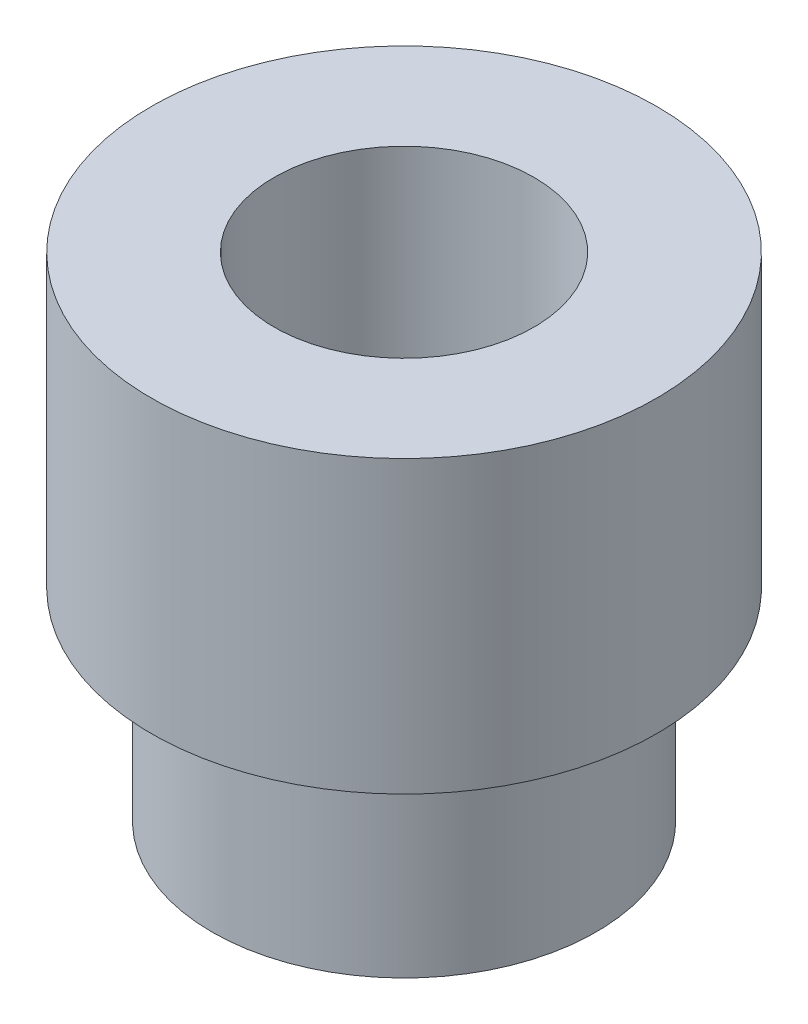
ISO-10303-21;
HEADER;
FILE_DESCRIPTION(('STEP AP214'),'2;1');
FILE_NAME('part.step','',(''),(''),'','','');
FILE_SCHEMA(('AUTOMOTIVE_DESIGN { 1 0 10303 214 1 1 1 1 }'));
ENDSEC;
DATA;
#1=APPLICATION_CONTEXT('core data for automotive mechanical design processes');
#2=APPLICATION_PROTOCOL_DEFINITION('international standard','automotive_design',2000,#1);
#3=PRODUCT_CONTEXT('',#1,'mechanical');
#4=PRODUCT('Part','Part','',(#3));
#5=PRODUCT_RELATED_PRODUCT_CATEGORY('part','',(#4));
#6=PRODUCT_DEFINITION_FORMATION('','',#4);
#7=PRODUCT_DEFINITION_CONTEXT('part definition',#1,'design');
#8=PRODUCT_DEFINITION('design','',#6,#7);
#9=PRODUCT_DEFINITION_SHAPE('','',#8);
#10=(LENGTH_UNIT() NAMED_UNIT(*) SI_UNIT(.MILLI.,.METRE.));
#11=(NAMED_UNIT(*) PLANE_ANGLE_UNIT() SI_UNIT($,.RADIAN.));
#12=(NAMED_UNIT(*) SI_UNIT($,.STERADIAN.) SOLID_ANGLE_UNIT());
#13=UNCERTAINTY_MEASURE_WITH_UNIT(LENGTH_MEASURE(1.E-05),#10,'distance_accuracy_value','');
#14=(GEOMETRIC_REPRESENTATION_CONTEXT(3) GLOBAL_UNCERTAINTY_ASSIGNED_CONTEXT((#13)) GLOBAL_UNIT_ASSIGNED_CONTEXT((#10,
#11,#12)) REPRESENTATION_CONTEXT('',''));
#15=CARTESIAN_POINT('',(0.,0.,0.));
#16=DIRECTION('',(0.,0.,1.));
#17=DIRECTION('',(1.,0.,0.));
#18=AXIS2_PLACEMENT_3D('',#15,#16,#17);
#19=CARTESIAN_POINT('',(0.,7.3025,0.));
#20=DIRECTION('',(0.,-1.,0.));
#21=DIRECTION('',(0.,0.,-1.));
#22=AXIS2_PLACEMENT_3D('',#19,#20,#21);
#23=CYLINDRICAL_SURFACE('',#22,6.35);
#24=CARTESIAN_POINT('',(0.,7.3025,0.));
#25=DIRECTION('',(0.,1.,0.));
#26=DIRECTION('',(0.,0.,1.));
#27=AXIS2_PLACEMENT_3D('',#24,#25,#26);
#28=CIRCLE('',#27,6.35);
#29=CARTESIAN_POINT('',(0.,7.3025,-6.35));
#30=VERTEX_POINT('',#29);
#31=EDGE_CURVE('E53',#30,#30,#28,.T.);
#32=CARTESIAN_POINT('',(0.,0.,0.));
#33=DIRECTION('',(0.,1.,0.));
#34=DIRECTION('',(0.,0.,1.));
#35=AXIS2_PLACEMENT_3D('',#32,#33,#34);
#36=CIRCLE('',#35,6.35);
#37=CARTESIAN_POINT('',(0.,0.,-6.35));
#38=VERTEX_POINT('',#37);
#39=EDGE_CURVE('E48',#38,#38,#36,.T.);
#40=CARTESIAN_POINT('',(0.,7.3025,-6.35));
#41=CARTESIAN_POINT('',(0.,7.22643229166667,-6.35));
#42=CARTESIAN_POINT('',(0.,7.15036458333333,-6.35));
#43=CARTESIAN_POINT('',(0.,6.99822916666667,-6.35));
#44=CARTESIAN_POINT('',(0.,6.92216145833333,-6.35));
#45=CARTESIAN_POINT('',(0.,6.77002604166667,-6.35));
#46=CARTESIAN_POINT('',(0.,6.69395833333333,-6.35));
#47=CARTESIAN_POINT('',(0.,6.54182291666667,-6.35));
#48=CARTESIAN_POINT('',(0.,6.46575520833333,-6.35));
#49=CARTESIAN_POINT('',(0.,6.31361979166667,-6.35));
#50=CARTESIAN_POINT('',(0.,6.23755208333333,-6.35));
#51=CARTESIAN_POINT('',(0.,6.08541666666667,-6.35));
#52=CARTESIAN_POINT('',(0.,6.00934895833333,-6.35));
#53=CARTESIAN_POINT('',(0.,5.85721354166667,-6.35));
#54=CARTESIAN_POINT('',(0.,5.78114583333333,-6.35));
#55=CARTESIAN_POINT('',(0.,5.62901041666667,-6.35));
#56=CARTESIAN_POINT('',(0.,5.55294270833333,-6.35));
#57=CARTESIAN_POINT('',(0.,5.40080729166667,-6.35));
#58=CARTESIAN_POINT('',(0.,5.32473958333333,-6.35));
#59=CARTESIAN_POINT('',(0.,5.17260416666667,-6.35));
#60=CARTESIAN_POINT('',(0.,5.09653645833333,-6.35));
#61=CARTESIAN_POINT('',(0.,4.94440104166667,-6.35));
#62=CARTESIAN_POINT('',(0.,4.86833333333333,-6.35));
#63=CARTESIAN_POINT('',(0.,4.71619791666667,-6.35));
#64=CARTESIAN_POINT('',(0.,4.64013020833333,-6.35));
#65=CARTESIAN_POINT('',(0.,4.48799479166667,-6.35));
#66=CARTESIAN_POINT('',(0.,4.41192708333333,-6.35));
#67=CARTESIAN_POINT('',(0.,4.25979166666667,-6.35));
#68=CARTESIAN_POINT('',(0.,4.18372395833333,-6.35));
#69=CARTESIAN_POINT('',(0.,4.03158854166667,-6.35));
#70=CARTESIAN_POINT('',(0.,3.95552083333333,-6.35));
#71=CARTESIAN_POINT('',(0.,3.80338541666667,-6.35));
#72=CARTESIAN_POINT('',(0.,3.72731770833333,-6.35));
#73=CARTESIAN_POINT('',(0.,3.57518229166667,-6.35));
#74=CARTESIAN_POINT('',(0.,3.49911458333333,-6.35));
#75=CARTESIAN_POINT('',(0.,3.34697916666667,-6.35));
#76=CARTESIAN_POINT('',(0.,3.27091145833333,-6.35));
#77=CARTESIAN_POINT('',(0.,3.11877604166667,-6.35));
#78=CARTESIAN_POINT('',(0.,3.04270833333333,-6.35));
#79=CARTESIAN_POINT('',(0.,2.89057291666667,-6.35));
#80=CARTESIAN_POINT('',(0.,2.81450520833333,-6.35));
#81=CARTESIAN_POINT('',(0.,2.66236979166667,-6.35));
#82=CARTESIAN_POINT('',(0.,2.58630208333333,-6.35));
#83=CARTESIAN_POINT('',(0.,2.43416666666667,-6.35));
#84=CARTESIAN_POINT('',(0.,2.35809895833333,-6.35));
#85=CARTESIAN_POINT('',(0.,2.20596354166667,-6.35));
#86=CARTESIAN_POINT('',(0.,2.12989583333333,-6.35));
#87=CARTESIAN_POINT('',(0.,1.97776041666667,-6.35));
#88=CARTESIAN_POINT('',(0.,1.90169270833333,-6.35));
#89=CARTESIAN_POINT('',(0.,1.74955729166667,-6.35));
#90=CARTESIAN_POINT('',(0.,1.67348958333333,-6.35));
#91=CARTESIAN_POINT('',(0.,1.52135416666667,-6.35));
#92=CARTESIAN_POINT('',(0.,1.44528645833333,-6.35));
#93=CARTESIAN_POINT('',(0.,1.29315104166667,-6.35));
#94=CARTESIAN_POINT('',(0.,1.21708333333333,-6.35));
#95=CARTESIAN_POINT('',(0.,1.06494791666667,-6.35));
#96=CARTESIAN_POINT('',(0.,0.988880208333334,-6.35));
#97=CARTESIAN_POINT('',(0.,0.836744791666667,-6.35));
#98=CARTESIAN_POINT('',(0.,0.760677083333333,-6.35));
#99=CARTESIAN_POINT('',(0.,0.608541666666667,-6.35));
#100=CARTESIAN_POINT('',(0.,0.532473958333333,-6.35));
#101=CARTESIAN_POINT('',(0.,0.380338541666667,-6.35));
#102=CARTESIAN_POINT('',(0.,0.304270833333333,-6.35));
#103=CARTESIAN_POINT('',(0.,0.152135416666666,-6.35));
#104=CARTESIAN_POINT('',(0.,0.0760677083333332,-6.35));
#105=CARTESIAN_POINT('',(0.,0.,-6.35));
#106=B_SPLINE_CURVE_WITH_KNOTS('',3,(#40,#41,#42,#43,#44,#45,#46,#47,#48,#49,#50,#51,#52,#53,
#54,#55,#56,#57,#58,#59,#60,#61,#62,#63,#64,#65,#66,#67,#68,#69,#70,#71,#72,#73,#74,#75,#76,#77,
#78,#79,#80,#81,#82,#83,#84,#85,#86,#87,#88,#89,#90,#91,#92,#93,#94,#95,#96,#97,#98,#99,#100,
#101,#102,#103,#104,#105),.UNSPECIFIED.,.F.,.F.,(4,2,2,2,2,2,2,2,2,2,2,2,2,2,2,2,2,2,2,2,2,2,2,
2,2,2,2,2,2,2,2,2,4),(0.,0.228203125000001,0.45640625,0.684609375,0.9128125,1.141015625,
1.36921875,1.597421875,1.825625,2.053828125,2.28203125,2.510234375,2.7384375,2.966640625,
3.19484375,3.423046875,3.65125,3.879453125,4.10765625,4.335859375,4.5640625,4.792265625,
5.02046875,5.248671875,5.476875,5.705078125,5.93328125,6.161484375,6.3896875,6.617890625,
6.84609375,7.074296875,7.3025),.UNSPECIFIED.);
#107=EDGE_CURVE('BSEAM45',#30,#38,#106,.T.);
#108=ORIENTED_EDGE('',*,*,#31,.F.);
#109=ORIENTED_EDGE('',*,*,#39,.T.);
#110=ORIENTED_EDGE('',*,*,#107,.T.);
#111=ORIENTED_EDGE('',*,*,#107,.F.);
#112=EDGE_LOOP('',(#108,#110,#109,#111));
#113=FACE_BOUND('',#112,.T.);
#114=ADVANCED_FACE('F45',(#113),#23,.T.);
#115=CARTESIAN_POINT('',(0.,7.3025,0.));
#116=DIRECTION('',(0.,-1.,0.));
#117=DIRECTION('',(0.,0.,-1.));
#118=AXIS2_PLACEMENT_3D('',#115,#116,#117);
#119=CYLINDRICAL_SURFACE('',#118,3.2639);
#120=CARTESIAN_POINT('',(0.,7.3025,0.));
#121=DIRECTION('',(0.,1.,0.));
#122=DIRECTION('',(0.,0.,1.));
#123=AXIS2_PLACEMENT_3D('',#120,#121,#122);
#124=CIRCLE('',#123,3.2639);
#125=CARTESIAN_POINT('',(0.,7.3025,-3.2639));
#126=VERTEX_POINT('',#125);
#127=EDGE_CURVE('E10',#126,#126,#124,.T.);
#128=CARTESIAN_POINT('',(0.,-5.08,0.));
#129=DIRECTION('',(0.,1.,0.));
#130=DIRECTION('',(0.,0.,1.));
#131=AXIS2_PLACEMENT_3D('',#128,#129,#130);
#132=CIRCLE('',#131,3.2639);
#133=CARTESIAN_POINT('',(0.,-5.08,-3.2639));
#134=VERTEX_POINT('',#133);
#135=EDGE_CURVE('E64',#134,#134,#132,.T.);
#136=CARTESIAN_POINT('',(0.,7.3025,-3.2639));
#137=CARTESIAN_POINT('',(0.,7.173515625,-3.2639));
#138=CARTESIAN_POINT('',(0.,7.04453125,-3.2639));
#139=CARTESIAN_POINT('',(0.,6.7865625,-3.2639));
#140=CARTESIAN_POINT('',(0.,6.657578125,-3.2639));
#141=CARTESIAN_POINT('',(0.,6.399609375,-3.2639));
#142=CARTESIAN_POINT('',(0.,6.270625,-3.2639));
#143=CARTESIAN_POINT('',(0.,6.01265625,-3.2639));
#144=CARTESIAN_POINT('',(0.,5.883671875,-3.2639));
#145=CARTESIAN_POINT('',(0.,5.625703125,-3.2639));
#146=CARTESIAN_POINT('',(0.,5.49671875,-3.2639));
#147=CARTESIAN_POINT('',(0.,5.23875,-3.2639));
#148=CARTESIAN_POINT('',(0.,5.109765625,-3.2639));
#149=CARTESIAN_POINT('',(0.,4.851796875,-3.2639));
#150=CARTESIAN_POINT('',(0.,4.7228125,-3.2639));
#151=CARTESIAN_POINT('',(0.,4.46484375,-3.2639));
#152=CARTESIAN_POINT('',(0.,4.335859375,-3.2639));
#153=CARTESIAN_POINT('',(0.,4.077890625,-3.2639));
#154=CARTESIAN_POINT('',(0.,3.94890625,-3.2639));
#155=CARTESIAN_POINT('',(0.,3.6909375,-3.2639));
#156=CARTESIAN_POINT('',(0.,3.561953125,-3.2639));
#157=CARTESIAN_POINT('',(0.,3.303984375,-3.2639));
#158=CARTESIAN_POINT('',(0.,3.175,-3.2639));
#159=CARTESIAN_POINT('',(0.,2.91703125,-3.2639));
#160=CARTESIAN_POINT('',(0.,2.788046875,-3.2639));
#161=CARTESIAN_POINT('',(0.,2.530078125,-3.2639));
#162=CARTESIAN_POINT('',(0.,2.40109375,-3.2639));
#163=CARTESIAN_POINT('',(0.,2.143125,-3.2639));
#164=CARTESIAN_POINT('',(0.,2.014140625,-3.2639));
#165=CARTESIAN_POINT('',(0.,1.756171875,-3.2639));
#166=CARTESIAN_POINT('',(0.,1.6271875,-3.2639));
#167=CARTESIAN_POINT('',(0.,1.36921875,-3.2639));
#168=CARTESIAN_POINT('',(0.,1.240234375,-3.2639));
#169=CARTESIAN_POINT('',(0.,0.982265624999999,-3.2639));
#170=CARTESIAN_POINT('',(0.,0.853281249999999,-3.2639));
#171=CARTESIAN_POINT('',(0.,0.595312499999999,-3.2639));
#172=CARTESIAN_POINT('',(0.,0.466328124999998,-3.2639));
#173=CARTESIAN_POINT('',(0.,0.208359374999998,-3.2639));
#174=CARTESIAN_POINT('',(0.,0.0793749999999984,-3.2639));
#175=CARTESIAN_POINT('',(0.,-0.178593750000002,-3.2639));
#176=CARTESIAN_POINT('',(0.,-0.307578125000002,-3.2639));
#177=CARTESIAN_POINT('',(0.,-0.565546875000001,-3.2639));
#178=CARTESIAN_POINT('',(0.,-0.69453125,-3.2639));
#179=CARTESIAN_POINT('',(0.,-0.952499999999999,-3.2639));
#180=CARTESIAN_POINT('',(0.,-1.081484375,-3.2639));
#181=CARTESIAN_POINT('',(0.,-1.339453125,-3.2639));
#182=CARTESIAN_POINT('',(0.,-1.4684375,-3.2639));
#183=CARTESIAN_POINT('',(0.,-1.72640625,-3.2639));
#184=CARTESIAN_POINT('',(0.,-1.855390625,-3.2639));
#185=CARTESIAN_POINT('',(0.,-2.113359375,-3.2639));
#186=CARTESIAN_POINT('',(0.,-2.24234375,-3.2639));
#187=CARTESIAN_POINT('',(0.,-2.5003125,-3.2639));
#188=CARTESIAN_POINT('',(0.,-2.629296875,-3.2639));
#189=CARTESIAN_POINT('',(0.,-2.887265625,-3.2639));
#190=CARTESIAN_POINT('',(0.,-3.01625,-3.2639));
#191=CARTESIAN_POINT('',(0.,-3.27421875,-3.2639));
#192=CARTESIAN_POINT('',(0.,-3.403203125,-3.2639));
#193=CARTESIAN_POINT('',(0.,-3.661171875,-3.2639));
#194=CARTESIAN_POINT('',(0.,-3.79015625,-3.2639));
#195=CARTESIAN_POINT('',(0.,-4.048125,-3.2639));
#196=CARTESIAN_POINT('',(0.,-4.177109375,-3.2639));
#197=CARTESIAN_POINT('',(0.,-4.435078125,-3.2639));
#198=CARTESIAN_POINT('',(0.,-4.5640625,-3.2639));
#199=CARTESIAN_POINT('',(0.,-4.82203125,-3.2639));
#200=CARTESIAN_POINT('',(0.,-4.951015625,-3.2639));
#201=CARTESIAN_POINT('',(0.,-5.08,-3.2639));
#202=B_SPLINE_CURVE_WITH_KNOTS('',3,(#136,#137,#138,#139,#140,#141,#142,#143,#144,#145,#146,
#147,#148,#149,#150,#151,#152,#153,#154,#155,#156,#157,#158,#159,#160,#161,#162,#163,#164,#165,
#166,#167,#168,#169,#170,#171,#172,#173,#174,#175,#176,#177,#178,#179,#180,#181,#182,#183,#184,
#185,#186,#187,#188,#189,#190,#191,#192,#193,#194,#195,#196,#197,#198,#199,#200,#201),
.UNSPECIFIED.,.F.,.F.,(4,2,2,2,2,2,2,2,2,2,2,2,2,2,2,2,2,2,2,2,2,2,2,2,2,2,2,2,2,2,2,2,4),(0.,
0.386953125,0.773906249999999,1.160859375,1.5478125,1.934765625,2.32171875,2.708671875,3.095625,
3.482578125,3.86953125,4.256484375,4.6434375,5.030390625,5.41734375,5.804296875,6.19125,
6.578203125,6.96515625,7.352109375,7.7390625,8.126015625,8.51296875,8.899921875,9.286875,
9.673828125,10.06078125,10.447734375,10.8346875,11.221640625,11.60859375,11.995546875,12.3825),.UNSPECIFIED.);
#203=EDGE_CURVE('BSEAM76',#126,#134,#202,.T.);
#204=ORIENTED_EDGE('',*,*,#127,.T.);
#205=ORIENTED_EDGE('',*,*,#135,.F.);
#206=ORIENTED_EDGE('',*,*,#203,.T.);
#207=ORIENTED_EDGE('',*,*,#203,.F.);
#208=EDGE_LOOP('',(#204,#206,#205,#207));
#209=FACE_BOUND('',#208,.T.);
#210=ADVANCED_FACE('F76',(#209),#119,.F.);
#211=CARTESIAN_POINT('',(0.,7.3025,0.));
#212=DIRECTION('',(0.,1.,0.));
#213=DIRECTION('',(0.,0.,1.));
#214=AXIS2_PLACEMENT_3D('',#211,#212,#213);
#215=PLANE('',#214);
#216=ORIENTED_EDGE('',*,*,#31,.T.);
#217=EDGE_LOOP('',(#216));
#218=FACE_BOUND('',#217,.T.);
#219=ORIENTED_EDGE('',*,*,#127,.F.);
#220=EDGE_LOOP('',(#219));
#221=FACE_BOUND('',#220,.T.);
#222=ADVANCED_FACE('F78',(#218,#221),#215,.T.);
#223=CARTESIAN_POINT('',(0.,0.,0.));
#224=DIRECTION('',(0.,1.,0.));
#225=DIRECTION('',(0.,0.,1.));
#226=AXIS2_PLACEMENT_3D('',#223,#224,#225);
#227=PLANE('',#226);
#228=CARTESIAN_POINT('',(0.,0.,0.));
#229=DIRECTION('',(0.,1.,0.));
#230=DIRECTION('',(0.,0.,1.));
#231=AXIS2_PLACEMENT_3D('',#228,#229,#230);
#232=CIRCLE('',#231,4.826);
#233=CARTESIAN_POINT('',(0.,0.,4.826));
#234=VERTEX_POINT('',#233);
#235=EDGE_CURVE('E60',#234,#234,#232,.T.);
#236=ORIENTED_EDGE('',*,*,#235,.T.);
#237=EDGE_LOOP('',(#236));
#238=FACE_BOUND('',#237,.T.);
#239=ORIENTED_EDGE('',*,*,#39,.F.);
#240=EDGE_LOOP('',(#239));
#241=FACE_BOUND('',#240,.T.);
#242=ADVANCED_FACE('F83',(#238,#241),#227,.F.);
#243=CARTESIAN_POINT('',(0.,-5.08,0.));
#244=DIRECTION('',(0.,1.,0.));
#245=DIRECTION('',(0.,0.,1.));
#246=AXIS2_PLACEMENT_3D('',#243,#244,#245);
#247=CYLINDRICAL_SURFACE('',#246,4.826);
#248=CARTESIAN_POINT('',(0.,-5.08,0.));
#249=DIRECTION('',(0.,1.,0.));
#250=DIRECTION('',(0.,0.,1.));
#251=AXIS2_PLACEMENT_3D('',#248,#249,#250);
#252=CIRCLE('',#251,4.826);
#253=CARTESIAN_POINT('',(0.,-5.08,4.826));
#254=VERTEX_POINT('',#253);
#255=EDGE_CURVE('E65',#254,#254,#252,.T.);
#256=ORIENTED_EDGE('',*,*,#255,.T.);
#257=EDGE_LOOP('',(#256));
#258=FACE_BOUND('',#257,.T.);
#259=ORIENTED_EDGE('',*,*,#235,.F.);
#260=EDGE_LOOP('',(#259));
#261=FACE_BOUND('',#260,.T.);
#262=ADVANCED_FACE('F89',(#258,#261),#247,.T.);
#263=CARTESIAN_POINT('',(0.,-5.08,0.));
#264=DIRECTION('',(0.,1.,0.));
#265=DIRECTION('',(0.,0.,1.));
#266=AXIS2_PLACEMENT_3D('',#263,#264,#265);
#267=PLANE('',#266);
#268=ORIENTED_EDGE('',*,*,#135,.T.);
#269=EDGE_LOOP('',(#268));
#270=FACE_BOUND('',#269,.T.);
#271=ORIENTED_EDGE('',*,*,#255,.F.);
#272=EDGE_LOOP('',(#271));
#273=FACE_BOUND('',#272,.T.);
#274=ADVANCED_FACE('F73',(#270,#273),#267,.F.);
#275=CLOSED_SHELL('',(#114,#210,#222,#242,#262,#274));
#276=MANIFOLD_SOLID_BREP('B2',#275);
#277=ADVANCED_BREP_SHAPE_REPRESENTATION('',(#18,#276),#14);
#278=SHAPE_DEFINITION_REPRESENTATION(#9,#277);
ENDSEC;
END-ISO-10303-21;
